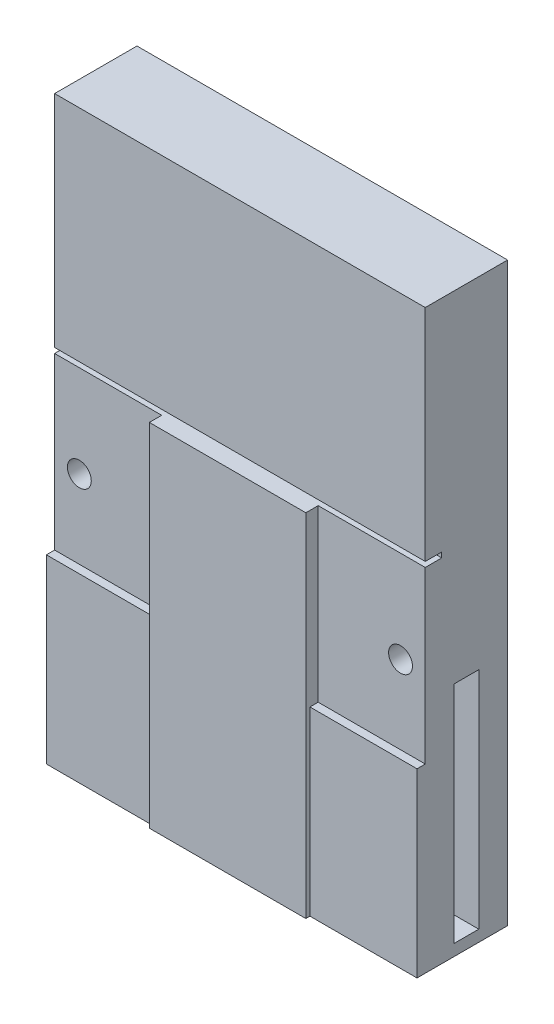
ISO-10303-21;
HEADER;
FILE_DESCRIPTION(('STEP AP214'),'2;1');
FILE_NAME('part.step','',(''),(''),'','','');
FILE_SCHEMA(('AUTOMOTIVE_DESIGN { 1 0 10303 214 1 1 1 1 }'));
ENDSEC;
DATA;
#1=APPLICATION_CONTEXT('core data for automotive mechanical design processes');
#2=APPLICATION_PROTOCOL_DEFINITION('international standard','automotive_design',2000,#1);
#3=PRODUCT_CONTEXT('',#1,'mechanical');
#4=PRODUCT('Part','Part','',(#3));
#5=PRODUCT_RELATED_PRODUCT_CATEGORY('part','',(#4));
#6=PRODUCT_DEFINITION_FORMATION('','',#4);
#7=PRODUCT_DEFINITION_CONTEXT('part definition',#1,'design');
#8=PRODUCT_DEFINITION('design','',#6,#7);
#9=PRODUCT_DEFINITION_SHAPE('','',#8);
#10=(LENGTH_UNIT() NAMED_UNIT(*) SI_UNIT(.MILLI.,.METRE.));
#11=(NAMED_UNIT(*) PLANE_ANGLE_UNIT() SI_UNIT($,.RADIAN.));
#12=(NAMED_UNIT(*) SI_UNIT($,.STERADIAN.) SOLID_ANGLE_UNIT());
#13=UNCERTAINTY_MEASURE_WITH_UNIT(LENGTH_MEASURE(1.E-05),#10,'distance_accuracy_value','');
#14=(GEOMETRIC_REPRESENTATION_CONTEXT(3) GLOBAL_UNCERTAINTY_ASSIGNED_CONTEXT((#13)) GLOBAL_UNIT_ASSIGNED_CONTEXT((#10,
#11,#12)) REPRESENTATION_CONTEXT('',''));
#15=CARTESIAN_POINT('',(0.,0.,0.));
#16=DIRECTION('',(0.,0.,1.));
#17=DIRECTION('',(1.,0.,0.));
#18=AXIS2_PLACEMENT_3D('',#15,#16,#17);
#19=CARTESIAN_POINT('',(-22.5,40.,-4.99999999999999));
#20=DIRECTION('',(1.,0.,0.));
#21=DIRECTION('',(0.,0.,-1.));
#22=AXIS2_PLACEMENT_3D('',#19,#20,#21);
#23=PLANE('',#22);
#24=DIRECTION('',(0.,-1.,0.));
#25=VECTOR('',#24,1.);
#26=CARTESIAN_POINT('',(-22.5,23.2974929319475,3.));
#27=LINE('',#26,#25);
#28=CARTESIAN_POINT('',(-22.5,23.2974929319475,3.));
#29=VERTEX_POINT('',#28);
#30=CARTESIAN_POINT('',(-22.5,22.6713275749144,3.));
#31=VERTEX_POINT('',#30);
#32=EDGE_CURVE('E331',#29,#31,#27,.T.);
#33=ORIENTED_EDGE('',*,*,#32,.F.);
#34=DIRECTION('',(0.,0.,1.));
#35=VECTOR('',#34,1.);
#36=CARTESIAN_POINT('',(-22.5,23.2974929319475,3.));
#37=LINE('',#36,#35);
#38=CARTESIAN_POINT('',(-22.5,23.2974929319475,5.));
#39=VERTEX_POINT('',#38);
#40=EDGE_CURVE('E347',#29,#39,#37,.T.);
#41=ORIENTED_EDGE('',*,*,#40,.T.);
#42=DIRECTION('',(0.,-1.,0.));
#43=VECTOR('',#42,1.);
#44=CARTESIAN_POINT('',(-22.5,40.,5.00000000000001));
#45=LINE('',#44,#43);
#46=CARTESIAN_POINT('',(-22.5,50.,5.));
#47=VERTEX_POINT('',#46);
#48=EDGE_CURVE('E11',#47,#39,#45,.T.);
#49=ORIENTED_EDGE('',*,*,#48,.F.);
#50=DIRECTION('',(0.,0.,1.));
#51=VECTOR('',#50,1.);
#52=CARTESIAN_POINT('',(-22.5,50.,-4.99999999999999));
#53=LINE('',#52,#51);
#54=CARTESIAN_POINT('',(-22.5,50.,-4.99999999999999));
#55=VERTEX_POINT('',#54);
#56=EDGE_CURVE('E371',#55,#47,#53,.T.);
#57=ORIENTED_EDGE('',*,*,#56,.F.);
#58=DIRECTION('',(0.,-1.,0.));
#59=VECTOR('',#58,1.);
#60=CARTESIAN_POINT('',(-22.5,40.,-4.99999999999999));
#61=LINE('',#60,#59);
#62=CARTESIAN_POINT('',(-22.5,-20.,-5.));
#63=VERTEX_POINT('',#62);
#64=EDGE_CURVE('E383',#55,#63,#61,.T.);
#65=ORIENTED_EDGE('',*,*,#64,.T.);
#66=DIRECTION('',(0.,0.,-1.));
#67=VECTOR('',#66,1.);
#68=CARTESIAN_POINT('',(-22.5,-20.,5.00000000000001));
#69=LINE('',#68,#67);
#70=CARTESIAN_POINT('',(-22.5,-20.,6.));
#71=VERTEX_POINT('',#70);
#72=EDGE_CURVE('E363',#71,#63,#69,.T.);
#73=ORIENTED_EDGE('',*,*,#72,.F.);
#74=DIRECTION('',(0.,1.,0.));
#75=VECTOR('',#74,1.);
#76=CARTESIAN_POINT('',(-22.5,2.,6.));
#77=LINE('',#76,#75);
#78=CARTESIAN_POINT('',(-22.5,2.,6.));
#79=VERTEX_POINT('',#78);
#80=EDGE_CURVE('E221',#71,#79,#77,.T.);
#81=ORIENTED_EDGE('',*,*,#80,.T.);
#82=DIRECTION('',(0.,0.,-1.));
#83=VECTOR('',#82,1.);
#84=CARTESIAN_POINT('',(-22.5,2.,6.));
#85=LINE('',#84,#83);
#86=CARTESIAN_POINT('',(-22.5,2.,5.));
#87=VERTEX_POINT('',#86);
#88=EDGE_CURVE('E220',#79,#87,#85,.T.);
#89=ORIENTED_EDGE('',*,*,#88,.T.);
#90=CARTESIAN_POINT('',(-22.5,22.6713275749144,5.));
#91=VERTEX_POINT('',#90);
#92=EDGE_CURVE('E49',#91,#87,#45,.T.);
#93=ORIENTED_EDGE('',*,*,#92,.F.);
#94=DIRECTION('',(0.,0.,1.));
#95=VECTOR('',#94,1.);
#96=CARTESIAN_POINT('',(-22.5,22.6713275749144,3.));
#97=LINE('',#96,#95);
#98=EDGE_CURVE('E342',#31,#91,#97,.T.);
#99=ORIENTED_EDGE('',*,*,#98,.F.);
#100=EDGE_LOOP('',(#33,#41,#49,#57,#65,#73,#81,#89,#93,#99));
#101=FACE_BOUND('',#100,.T.);
#102=DIRECTION('',(0.,-1.,0.));
#103=VECTOR('',#102,1.);
#104=CARTESIAN_POINT('',(-22.5,8.67132757491439,1.5));
#105=LINE('',#104,#103);
#106=CARTESIAN_POINT('',(-22.5,8.67132757491439,1.5));
#107=VERTEX_POINT('',#106);
#108=CARTESIAN_POINT('',(-22.5,-18.6150080325972,1.5));
#109=VERTEX_POINT('',#108);
#110=EDGE_CURVE('E65',#107,#109,#105,.T.);
#111=ORIENTED_EDGE('',*,*,#110,.T.);
#112=DIRECTION('',(0.,0.,-1.));
#113=VECTOR('',#112,1.);
#114=CARTESIAN_POINT('',(-22.5,-18.6150080325972,1.5));
#115=LINE('',#114,#113);
#116=CARTESIAN_POINT('',(-22.5,-18.6150080325972,-1.5));
#117=VERTEX_POINT('',#116);
#118=EDGE_CURVE('E237',#109,#117,#115,.T.);
#119=ORIENTED_EDGE('',*,*,#118,.T.);
#120=DIRECTION('',(0.,1.,0.));
#121=VECTOR('',#120,1.);
#122=CARTESIAN_POINT('',(-22.5,8.67132757491439,-1.5));
#123=LINE('',#122,#121);
#124=CARTESIAN_POINT('',(-22.5,8.67132757491439,-1.5));
#125=VERTEX_POINT('',#124);
#126=EDGE_CURVE('E246',#117,#125,#123,.T.);
#127=ORIENTED_EDGE('',*,*,#126,.T.);
#128=DIRECTION('',(0.,0.,1.));
#129=VECTOR('',#128,1.);
#130=CARTESIAN_POINT('',(-22.5,8.67132757491439,1.5));
#131=LINE('',#130,#129);
#132=EDGE_CURVE('E228',#125,#107,#131,.T.);
#133=ORIENTED_EDGE('',*,*,#132,.T.);
#134=EDGE_LOOP('',(#111,#119,#127,#133));
#135=FACE_BOUND('',#134,.T.);
#136=ADVANCED_FACE('F41',(#101,#135),#23,.F.);
#137=CARTESIAN_POINT('',(22.5,40.,5.));
#138=DIRECTION('',(0.,0.,-1.));
#139=DIRECTION('',(-1.,0.,0.));
#140=AXIS2_PLACEMENT_3D('',#137,#138,#139);
#141=PLANE('',#140);
#142=CARTESIAN_POINT('',(19.5,11.5,5.));
#143=DIRECTION('',(0.,0.,1.));
#144=DIRECTION('',(1.,0.,0.));
#145=AXIS2_PLACEMENT_3D('',#142,#143,#144);
#146=CIRCLE('',#145,1.45);
#147=CARTESIAN_POINT('',(20.95,11.5,5.));
#148=VERTEX_POINT('',#147);
#149=EDGE_CURVE('E357',#148,#148,#146,.T.);
#150=ORIENTED_EDGE('',*,*,#149,.F.);
#151=EDGE_LOOP('',(#150));
#152=FACE_BOUND('',#151,.T.);
#153=DIRECTION('',(-1.,0.,0.));
#154=VECTOR('',#153,1.);
#155=CARTESIAN_POINT('',(9.5,2.,5.));
#156=LINE('',#155,#154);
#157=CARTESIAN_POINT('',(22.5,2.,5.));
#158=VERTEX_POINT('',#157);
#159=CARTESIAN_POINT('',(9.5,2.,5.));
#160=VERTEX_POINT('',#159);
#161=EDGE_CURVE('E253',#158,#160,#156,.T.);
#162=ORIENTED_EDGE('',*,*,#161,.F.);
#163=DIRECTION('',(0.,-1.,0.));
#164=VECTOR('',#163,1.);
#165=CARTESIAN_POINT('',(22.5,40.,5.));
#166=LINE('',#165,#164);
#167=CARTESIAN_POINT('',(22.5,22.6713275749144,5.));
#168=VERTEX_POINT('',#167);
#169=EDGE_CURVE('E387',#168,#158,#166,.T.);
#170=ORIENTED_EDGE('',*,*,#169,.F.);
#171=DIRECTION('',(1.,0.,0.));
#172=VECTOR('',#171,1.);
#173=CARTESIAN_POINT('',(-22.5,22.6713275749144,5.));
#174=LINE('',#173,#172);
#175=CARTESIAN_POINT('',(9.49999999999998,22.6713275749144,5.));
#176=VERTEX_POINT('',#175);
#177=EDGE_CURVE('E330',#176,#168,#174,.T.);
#178=ORIENTED_EDGE('',*,*,#177,.F.);
#179=DIRECTION('',(0.,1.,0.));
#180=VECTOR('',#179,1.);
#181=CARTESIAN_POINT('',(9.49999999999999,22.6713275749144,5.));
#182=LINE('',#181,#180);
#183=EDGE_CURVE('E312',#160,#176,#182,.T.);
#184=ORIENTED_EDGE('',*,*,#183,.F.);
#185=EDGE_LOOP('',(#162,#170,#178,#184));
#186=FACE_BOUND('',#185,.T.);
#187=ADVANCED_FACE('F417',(#152,#186),#141,.F.);
#188=CARTESIAN_POINT('',(9.49999999999999,22.6713275749144,6.5));
#189=DIRECTION('',(-1.,0.,0.));
#190=DIRECTION('',(0.,-1.,0.));
#191=AXIS2_PLACEMENT_3D('',#188,#189,#190);
#192=PLANE('',#191);
#193=DIRECTION('',(0.,0.,-1.));
#194=VECTOR('',#193,1.);
#195=CARTESIAN_POINT('',(9.5,2.,6.));
#196=LINE('',#195,#194);
#197=CARTESIAN_POINT('',(9.49999999999999,2.,6.));
#198=VERTEX_POINT('',#197);
#199=EDGE_CURVE('E270',#198,#160,#196,.T.);
#200=ORIENTED_EDGE('',*,*,#199,.T.);
#201=ORIENTED_EDGE('',*,*,#183,.T.);
#202=DIRECTION('',(0.,0.,-1.));
#203=VECTOR('',#202,1.);
#204=CARTESIAN_POINT('',(9.49999999999999,22.6713275749144,6.5));
#205=LINE('',#204,#203);
#206=CARTESIAN_POINT('',(9.49999999999999,22.6713275749144,6.5));
#207=VERTEX_POINT('',#206);
#208=EDGE_CURVE('E322',#207,#176,#205,.T.);
#209=ORIENTED_EDGE('',*,*,#208,.F.);
#210=DIRECTION('',(0.,1.,0.));
#211=VECTOR('',#210,1.);
#212=CARTESIAN_POINT('',(9.49999999999999,22.6713275749144,6.5));
#213=LINE('',#212,#211);
#214=CARTESIAN_POINT('',(9.5,-20.,6.5));
#215=VERTEX_POINT('',#214);
#216=EDGE_CURVE('E314',#215,#207,#213,.T.);
#217=ORIENTED_EDGE('',*,*,#216,.F.);
#218=DIRECTION('',(0.,0.,-1.));
#219=VECTOR('',#218,1.);
#220=CARTESIAN_POINT('',(9.5,-20.,6.5));
#221=LINE('',#220,#219);
#222=CARTESIAN_POINT('',(9.49999999999999,-20.,6.));
#223=VERTEX_POINT('',#222);
#224=EDGE_CURVE('E325',#215,#223,#221,.T.);
#225=ORIENTED_EDGE('',*,*,#224,.T.);
#226=DIRECTION('',(0.,-1.,0.));
#227=VECTOR('',#226,1.);
#228=CARTESIAN_POINT('',(9.5,2.,6.));
#229=LINE('',#228,#227);
#230=EDGE_CURVE('E259',#198,#223,#229,.T.);
#231=ORIENTED_EDGE('',*,*,#230,.F.);
#232=EDGE_LOOP('',(#200,#201,#209,#217,#225,#231));
#233=FACE_BOUND('',#232,.T.);
#234=ADVANCED_FACE('F424',(#233),#192,.F.);
#235=CARTESIAN_POINT('',(-19.5,11.5,5.));
#236=DIRECTION('',(0.,0.,1.));
#237=DIRECTION('',(1.,0.,0.));
#238=AXIS2_PLACEMENT_3D('',#235,#236,#237);
#239=CIRCLE('',#238,1.45);
#240=CARTESIAN_POINT('',(-18.05,11.5,5.));
#241=VERTEX_POINT('',#240);
#242=EDGE_CURVE('E350',#241,#241,#239,.T.);
#243=ORIENTED_EDGE('',*,*,#242,.F.);
#244=EDGE_LOOP('',(#243));
#245=FACE_BOUND('',#244,.T.);
#246=ORIENTED_EDGE('',*,*,#92,.T.);
#247=DIRECTION('',(1.,0.,0.));
#248=VECTOR('',#247,1.);
#249=CARTESIAN_POINT('',(-9.5,2.,5.));
#250=LINE('',#249,#248);
#251=CARTESIAN_POINT('',(-9.5,2.,5.));
#252=VERTEX_POINT('',#251);
#253=EDGE_CURVE('E213',#87,#252,#250,.T.);
#254=ORIENTED_EDGE('',*,*,#253,.T.);
#255=DIRECTION('',(0.,-1.,0.));
#256=VECTOR('',#255,1.);
#257=CARTESIAN_POINT('',(-9.50000000000001,22.6713275749144,5.));
#258=LINE('',#257,#256);
#259=CARTESIAN_POINT('',(-9.50000000000001,22.6713275749144,5.));
#260=VERTEX_POINT('',#259);
#261=EDGE_CURVE('E226',#260,#252,#258,.T.);
#262=ORIENTED_EDGE('',*,*,#261,.F.);
#263=EDGE_CURVE('E343',#91,#260,#174,.T.);
#264=ORIENTED_EDGE('',*,*,#263,.F.);
#265=EDGE_LOOP('',(#246,#254,#262,#264));
#266=FACE_BOUND('',#265,.T.);
#267=ADVANCED_FACE('F427',(#245,#266),#141,.F.);
#268=ORIENTED_EDGE('',*,*,#48,.T.);
#269=DIRECTION('',(-1.,0.,0.));
#270=VECTOR('',#269,1.);
#271=CARTESIAN_POINT('',(-22.5,23.2974929319475,5.));
#272=LINE('',#271,#270);
#273=CARTESIAN_POINT('',(22.5,23.2974929319475,5.));
#274=VERTEX_POINT('',#273);
#275=EDGE_CURVE('E335',#274,#39,#272,.T.);
#276=ORIENTED_EDGE('',*,*,#275,.F.);
#277=CARTESIAN_POINT('',(22.5,50.,5.));
#278=VERTEX_POINT('',#277);
#279=EDGE_CURVE('E388',#278,#274,#166,.T.);
#280=ORIENTED_EDGE('',*,*,#279,.F.);
#281=DIRECTION('',(1.,0.,0.));
#282=VECTOR('',#281,1.);
#283=CARTESIAN_POINT('',(-22.5,50.,5.));
#284=LINE('',#283,#282);
#285=EDGE_CURVE('E374',#47,#278,#284,.T.);
#286=ORIENTED_EDGE('',*,*,#285,.F.);
#287=EDGE_LOOP('',(#268,#276,#280,#286));
#288=FACE_BOUND('',#287,.T.);
#289=ADVANCED_FACE('F426',(#288),#141,.F.);
#290=CARTESIAN_POINT('',(22.5,40.,-5.));
#291=DIRECTION('',(-1.,0.,0.));
#292=DIRECTION('',(0.,0.,1.));
#293=AXIS2_PLACEMENT_3D('',#290,#291,#292);
#294=PLANE('',#293);
#295=DIRECTION('',(0.,0.,-1.));
#296=VECTOR('',#295,1.);
#297=CARTESIAN_POINT('',(22.5,-18.6150080325972,1.5));
#298=LINE('',#297,#296);
#299=CARTESIAN_POINT('',(22.5,-18.6150080325973,1.5));
#300=VERTEX_POINT('',#299);
#301=CARTESIAN_POINT('',(22.5,-18.6150080325972,-1.5));
#302=VERTEX_POINT('',#301);
#303=EDGE_CURVE('E292',#300,#302,#298,.T.);
#304=ORIENTED_EDGE('',*,*,#303,.F.);
#305=DIRECTION('',(0.,-1.,0.));
#306=VECTOR('',#305,1.);
#307=CARTESIAN_POINT('',(22.5,8.67132757491439,1.5));
#308=LINE('',#307,#306);
#309=CARTESIAN_POINT('',(22.5,8.67132757491439,1.5));
#310=VERTEX_POINT('',#309);
#311=EDGE_CURVE('E276',#310,#300,#308,.T.);
#312=ORIENTED_EDGE('',*,*,#311,.F.);
#313=DIRECTION('',(0.,0.,1.));
#314=VECTOR('',#313,1.);
#315=CARTESIAN_POINT('',(22.5,8.67132757491439,1.5));
#316=LINE('',#315,#314);
#317=CARTESIAN_POINT('',(22.5,8.67132757491439,-1.5));
#318=VERTEX_POINT('',#317);
#319=EDGE_CURVE('E281',#318,#310,#316,.T.);
#320=ORIENTED_EDGE('',*,*,#319,.F.);
#321=DIRECTION('',(0.,1.,0.));
#322=VECTOR('',#321,1.);
#323=CARTESIAN_POINT('',(22.5,8.67132757491439,-1.5));
#324=LINE('',#323,#322);
#325=EDGE_CURVE('E295',#302,#318,#324,.T.);
#326=ORIENTED_EDGE('',*,*,#325,.F.);
#327=EDGE_LOOP('',(#304,#312,#320,#326));
#328=FACE_BOUND('',#327,.T.);
#329=ORIENTED_EDGE('',*,*,#279,.T.);
#330=DIRECTION('',(0.,0.,1.));
#331=VECTOR('',#330,1.);
#332=CARTESIAN_POINT('',(22.5,23.2974929319475,3.));
#333=LINE('',#332,#331);
#334=CARTESIAN_POINT('',(22.5,23.2974929319475,3.));
#335=VERTEX_POINT('',#334);
#336=EDGE_CURVE('E351',#335,#274,#333,.T.);
#337=ORIENTED_EDGE('',*,*,#336,.F.);
#338=DIRECTION('',(0.,1.,0.));
#339=VECTOR('',#338,1.);
#340=CARTESIAN_POINT('',(22.5,23.2974929319475,3.));
#341=LINE('',#340,#339);
#342=CARTESIAN_POINT('',(22.5,22.6713275749144,3.));
#343=VERTEX_POINT('',#342);
#344=EDGE_CURVE('E337',#343,#335,#341,.T.);
#345=ORIENTED_EDGE('',*,*,#344,.F.);
#346=DIRECTION('',(0.,0.,1.));
#347=VECTOR('',#346,1.);
#348=CARTESIAN_POINT('',(22.5,22.6713275749144,3.));
#349=LINE('',#348,#347);
#350=EDGE_CURVE('E353',#343,#168,#349,.T.);
#351=ORIENTED_EDGE('',*,*,#350,.T.);
#352=ORIENTED_EDGE('',*,*,#169,.T.);
#353=DIRECTION('',(0.,0.,-1.));
#354=VECTOR('',#353,1.);
#355=CARTESIAN_POINT('',(22.5,2.,6.));
#356=LINE('',#355,#354);
#357=CARTESIAN_POINT('',(22.5,2.,6.));
#358=VERTEX_POINT('',#357);
#359=EDGE_CURVE('E274',#358,#158,#356,.T.);
#360=ORIENTED_EDGE('',*,*,#359,.F.);
#361=DIRECTION('',(0.,1.,0.));
#362=VECTOR('',#361,1.);
#363=CARTESIAN_POINT('',(22.5,2.,6.));
#364=LINE('',#363,#362);
#365=CARTESIAN_POINT('',(22.5,-20.,6.));
#366=VERTEX_POINT('',#365);
#367=EDGE_CURVE('E265',#366,#358,#364,.T.);
#368=ORIENTED_EDGE('',*,*,#367,.F.);
#369=DIRECTION('',(0.,0.,1.));
#370=VECTOR('',#369,1.);
#371=CARTESIAN_POINT('',(22.5,-20.,5.00000000000001));
#372=LINE('',#371,#370);
#373=CARTESIAN_POINT('',(22.5,-20.,-5.));
#374=VERTEX_POINT('',#373);
#375=EDGE_CURVE('E369',#374,#366,#372,.T.);
#376=ORIENTED_EDGE('',*,*,#375,.F.);
#377=DIRECTION('',(0.,-1.,0.));
#378=VECTOR('',#377,1.);
#379=CARTESIAN_POINT('',(22.5,40.,-5.));
#380=LINE('',#379,#378);
#381=CARTESIAN_POINT('',(22.5,50.,-4.99999999999999));
#382=VERTEX_POINT('',#381);
#383=EDGE_CURVE('E385',#382,#374,#380,.T.);
#384=ORIENTED_EDGE('',*,*,#383,.F.);
#385=DIRECTION('',(0.,0.,-1.));
#386=VECTOR('',#385,1.);
#387=CARTESIAN_POINT('',(22.5,50.,-4.99999999999999));
#388=LINE('',#387,#386);
#389=EDGE_CURVE('E377',#278,#382,#388,.T.);
#390=ORIENTED_EDGE('',*,*,#389,.F.);
#391=EDGE_LOOP('',(#329,#337,#345,#351,#352,#360,#368,#376,#384,#390));
#392=FACE_BOUND('',#391,.T.);
#393=ADVANCED_FACE('F526',(#328,#392),#294,.F.);
#394=CARTESIAN_POINT('',(22.5,40.,-5.));
#395=DIRECTION('',(0.,0.,1.));
#396=DIRECTION('',(1.,0.,0.));
#397=AXIS2_PLACEMENT_3D('',#394,#395,#396);
#398=PLANE('',#397);
#399=CARTESIAN_POINT('',(19.5,11.5,-5.));
#400=DIRECTION('',(0.,0.,1.));
#401=DIRECTION('',(1.,0.,0.));
#402=AXIS2_PLACEMENT_3D('',#399,#400,#401);
#403=CIRCLE('',#402,1.45);
#404=CARTESIAN_POINT('',(20.95,11.5,-5.));
#405=VERTEX_POINT('',#404);
#406=EDGE_CURVE('E44',#405,#405,#403,.T.);
#407=ORIENTED_EDGE('',*,*,#406,.T.);
#408=EDGE_LOOP('',(#407));
#409=FACE_BOUND('',#408,.T.);
#410=CARTESIAN_POINT('',(-19.5,11.5,-4.99999999999999));
#411=DIRECTION('',(0.,0.,1.));
#412=DIRECTION('',(1.,0.,0.));
#413=AXIS2_PLACEMENT_3D('',#410,#411,#412);
#414=CIRCLE('',#413,1.45);
#415=CARTESIAN_POINT('',(-18.05,11.5,-4.99999999999999));
#416=VERTEX_POINT('',#415);
#417=EDGE_CURVE('E360',#416,#416,#414,.T.);
#418=ORIENTED_EDGE('',*,*,#417,.T.);
#419=EDGE_LOOP('',(#418));
#420=FACE_BOUND('',#419,.T.);
#421=ORIENTED_EDGE('',*,*,#383,.T.);
#422=DIRECTION('',(1.,0.,0.));
#423=VECTOR('',#422,1.);
#424=CARTESIAN_POINT('',(-22.5,-20.,-5.));
#425=LINE('',#424,#423);
#426=EDGE_CURVE('E366',#63,#374,#425,.T.);
#427=ORIENTED_EDGE('',*,*,#426,.F.);
#428=ORIENTED_EDGE('',*,*,#64,.F.);
#429=DIRECTION('',(-1.,0.,0.));
#430=VECTOR('',#429,1.);
#431=CARTESIAN_POINT('',(-22.5,50.,-4.99999999999999));
#432=LINE('',#431,#430);
#433=EDGE_CURVE('E380',#382,#55,#432,.T.);
#434=ORIENTED_EDGE('',*,*,#433,.F.);
#435=EDGE_LOOP('',(#421,#427,#428,#434));
#436=FACE_BOUND('',#435,.T.);
#437=ADVANCED_FACE('F396',(#409,#420,#436),#398,.F.);
#438=CARTESIAN_POINT('',(0.,50.,0.));
#439=DIRECTION('',(0.,1.,0.));
#440=DIRECTION('',(0.,0.,1.));
#441=AXIS2_PLACEMENT_3D('',#438,#439,#440);
#442=PLANE('',#441);
#443=ORIENTED_EDGE('',*,*,#56,.T.);
#444=ORIENTED_EDGE('',*,*,#285,.T.);
#445=ORIENTED_EDGE('',*,*,#389,.T.);
#446=ORIENTED_EDGE('',*,*,#433,.T.);
#447=EDGE_LOOP('',(#443,#444,#445,#446));
#448=FACE_BOUND('',#447,.T.);
#449=ADVANCED_FACE('F537',(#448),#442,.T.);
#450=CARTESIAN_POINT('',(0.,-20.,0.));
#451=DIRECTION('',(0.,-1.,0.));
#452=DIRECTION('',(0.,0.,-1.));
#453=AXIS2_PLACEMENT_3D('',#450,#451,#452);
#454=PLANE('',#453);
#455=DIRECTION('',(-1.,0.,0.));
#456=VECTOR('',#455,1.);
#457=CARTESIAN_POINT('',(-9.49999999999999,-20.,6.));
#458=LINE('',#457,#456);
#459=CARTESIAN_POINT('',(-9.5,-20.,6.));
#460=VERTEX_POINT('',#459);
#461=EDGE_CURVE('E57',#460,#71,#458,.T.);
#462=ORIENTED_EDGE('',*,*,#461,.T.);
#463=ORIENTED_EDGE('',*,*,#72,.T.);
#464=ORIENTED_EDGE('',*,*,#426,.T.);
#465=ORIENTED_EDGE('',*,*,#375,.T.);
#466=DIRECTION('',(1.,0.,0.));
#467=VECTOR('',#466,1.);
#468=CARTESIAN_POINT('',(9.49999999999999,-20.,6.));
#469=LINE('',#468,#467);
#470=EDGE_CURVE('E262',#223,#366,#469,.T.);
#471=ORIENTED_EDGE('',*,*,#470,.F.);
#472=ORIENTED_EDGE('',*,*,#224,.F.);
#473=DIRECTION('',(1.,0.,0.));
#474=VECTOR('',#473,1.);
#475=CARTESIAN_POINT('',(-9.5,-20.,6.5));
#476=LINE('',#475,#474);
#477=CARTESIAN_POINT('',(-9.5,-20.,6.5));
#478=VERTEX_POINT('',#477);
#479=EDGE_CURVE('E311',#478,#215,#476,.T.);
#480=ORIENTED_EDGE('',*,*,#479,.F.);
#481=DIRECTION('',(0.,0.,-1.));
#482=VECTOR('',#481,1.);
#483=CARTESIAN_POINT('',(-9.5,-20.,6.5));
#484=LINE('',#483,#482);
#485=EDGE_CURVE('E328',#478,#460,#484,.T.);
#486=ORIENTED_EDGE('',*,*,#485,.T.);
#487=EDGE_LOOP('',(#462,#463,#464,#465,#471,#472,#480,#486));
#488=FACE_BOUND('',#487,.T.);
#489=ADVANCED_FACE('F412',(#488),#454,.T.);
#490=CARTESIAN_POINT('',(-19.5,11.5,-15.));
#491=DIRECTION('',(0.,0.,1.));
#492=DIRECTION('',(1.,0.,0.));
#493=AXIS2_PLACEMENT_3D('',#490,#491,#492);
#494=CYLINDRICAL_SURFACE('',#493,1.45);
#495=ORIENTED_EDGE('',*,*,#242,.T.);
#496=EDGE_LOOP('',(#495));
#497=FACE_BOUND('',#496,.T.);
#498=ORIENTED_EDGE('',*,*,#417,.F.);
#499=EDGE_LOOP('',(#498));
#500=FACE_BOUND('',#499,.T.);
#501=ADVANCED_FACE('F401',(#497,#500),#494,.F.);
#502=CARTESIAN_POINT('',(19.5,11.5,-15.));
#503=DIRECTION('',(0.,0.,1.));
#504=DIRECTION('',(1.,0.,0.));
#505=AXIS2_PLACEMENT_3D('',#502,#503,#504);
#506=CYLINDRICAL_SURFACE('',#505,1.45);
#507=ORIENTED_EDGE('',*,*,#149,.T.);
#508=EDGE_LOOP('',(#507));
#509=FACE_BOUND('',#508,.T.);
#510=ORIENTED_EDGE('',*,*,#406,.F.);
#511=EDGE_LOOP('',(#510));
#512=FACE_BOUND('',#511,.T.);
#513=ADVANCED_FACE('F398',(#509,#512),#506,.F.);
#514=CARTESIAN_POINT('',(-22.5,23.2974929319475,3.));
#515=DIRECTION('',(0.,1.,0.));
#516=DIRECTION('',(0.,0.,1.));
#517=AXIS2_PLACEMENT_3D('',#514,#515,#516);
#518=PLANE('',#517);
#519=ORIENTED_EDGE('',*,*,#275,.T.);
#520=ORIENTED_EDGE('',*,*,#40,.F.);
#521=DIRECTION('',(-1.,0.,0.));
#522=VECTOR('',#521,1.);
#523=CARTESIAN_POINT('',(-22.5,23.2974929319475,3.));
#524=LINE('',#523,#522);
#525=EDGE_CURVE('E339',#335,#29,#524,.T.);
#526=ORIENTED_EDGE('',*,*,#525,.F.);
#527=ORIENTED_EDGE('',*,*,#336,.T.);
#528=EDGE_LOOP('',(#519,#520,#526,#527));
#529=FACE_BOUND('',#528,.T.);
#530=ADVANCED_FACE('F400',(#529),#518,.F.);
#531=CARTESIAN_POINT('',(-22.5,22.6713275749144,3.));
#532=DIRECTION('',(0.,-1.,0.));
#533=DIRECTION('',(0.,0.,-1.));
#534=AXIS2_PLACEMENT_3D('',#531,#532,#533);
#535=PLANE('',#534);
#536=ORIENTED_EDGE('',*,*,#263,.T.);
#537=DIRECTION('',(0.,0.,-1.));
#538=VECTOR('',#537,1.);
#539=CARTESIAN_POINT('',(-9.50000000000001,22.6713275749144,6.5));
#540=LINE('',#539,#538);
#541=CARTESIAN_POINT('',(-9.50000000000001,22.6713275749144,6.5));
#542=VERTEX_POINT('',#541);
#543=EDGE_CURVE('E318',#542,#260,#540,.T.);
#544=ORIENTED_EDGE('',*,*,#543,.F.);
#545=DIRECTION('',(-1.,0.,0.));
#546=VECTOR('',#545,1.);
#547=CARTESIAN_POINT('',(-9.50000000000001,22.6713275749144,6.5));
#548=LINE('',#547,#546);
#549=EDGE_CURVE('E316',#207,#542,#548,.T.);
#550=ORIENTED_EDGE('',*,*,#549,.F.);
#551=ORIENTED_EDGE('',*,*,#208,.T.);
#552=ORIENTED_EDGE('',*,*,#177,.T.);
#553=ORIENTED_EDGE('',*,*,#350,.F.);
#554=DIRECTION('',(1.,0.,0.));
#555=VECTOR('',#554,1.);
#556=CARTESIAN_POINT('',(-22.5,22.6713275749144,3.));
#557=LINE('',#556,#555);
#558=EDGE_CURVE('E334',#31,#343,#557,.T.);
#559=ORIENTED_EDGE('',*,*,#558,.F.);
#560=ORIENTED_EDGE('',*,*,#98,.T.);
#561=EDGE_LOOP('',(#536,#544,#550,#551,#552,#553,#559,#560));
#562=FACE_BOUND('',#561,.T.);
#563=ADVANCED_FACE('F409',(#562),#535,.F.);
#564=CARTESIAN_POINT('',(0.,0.,3.));
#565=DIRECTION('',(0.,0.,1.));
#566=DIRECTION('',(1.,0.,0.));
#567=AXIS2_PLACEMENT_3D('',#564,#565,#566);
#568=PLANE('',#567);
#569=ORIENTED_EDGE('',*,*,#32,.T.);
#570=ORIENTED_EDGE('',*,*,#558,.T.);
#571=ORIENTED_EDGE('',*,*,#344,.T.);
#572=ORIENTED_EDGE('',*,*,#525,.T.);
#573=EDGE_LOOP('',(#569,#570,#571,#572));
#574=FACE_BOUND('',#573,.T.);
#575=ADVANCED_FACE('F497',(#574),#568,.T.);
#576=CARTESIAN_POINT('',(-9.50000000000001,22.6713275749144,6.5));
#577=DIRECTION('',(1.,0.,0.));
#578=DIRECTION('',(0.,1.,0.));
#579=AXIS2_PLACEMENT_3D('',#576,#577,#578);
#580=PLANE('',#579);
#581=ORIENTED_EDGE('',*,*,#261,.T.);
#582=DIRECTION('',(0.,0.,-1.));
#583=VECTOR('',#582,1.);
#584=CARTESIAN_POINT('',(-9.5,2.,6.));
#585=LINE('',#584,#583);
#586=CARTESIAN_POINT('',(-9.5,2.,6.));
#587=VERTEX_POINT('',#586);
#588=EDGE_CURVE('E218',#587,#252,#585,.T.);
#589=ORIENTED_EDGE('',*,*,#588,.F.);
#590=DIRECTION('',(0.,-1.,0.));
#591=VECTOR('',#590,1.);
#592=CARTESIAN_POINT('',(-9.5,2.,6.));
#593=LINE('',#592,#591);
#594=EDGE_CURVE('E204',#587,#460,#593,.T.);
#595=ORIENTED_EDGE('',*,*,#594,.T.);
#596=ORIENTED_EDGE('',*,*,#485,.F.);
#597=DIRECTION('',(0.,-1.,0.));
#598=VECTOR('',#597,1.);
#599=CARTESIAN_POINT('',(-9.50000000000001,22.6713275749144,6.5));
#600=LINE('',#599,#598);
#601=EDGE_CURVE('E308',#542,#478,#600,.T.);
#602=ORIENTED_EDGE('',*,*,#601,.F.);
#603=ORIENTED_EDGE('',*,*,#543,.T.);
#604=EDGE_LOOP('',(#581,#589,#595,#596,#602,#603));
#605=FACE_BOUND('',#604,.T.);
#606=ADVANCED_FACE('F224',(#605),#580,.F.);
#607=CARTESIAN_POINT('',(0.,0.,6.5));
#608=DIRECTION('',(0.,0.,1.));
#609=DIRECTION('',(1.,0.,0.));
#610=AXIS2_PLACEMENT_3D('',#607,#608,#609);
#611=PLANE('',#610);
#612=ORIENTED_EDGE('',*,*,#601,.T.);
#613=ORIENTED_EDGE('',*,*,#479,.T.);
#614=ORIENTED_EDGE('',*,*,#216,.T.);
#615=ORIENTED_EDGE('',*,*,#549,.T.);
#616=EDGE_LOOP('',(#612,#613,#614,#615));
#617=FACE_BOUND('',#616,.T.);
#618=ADVANCED_FACE('F487',(#617),#611,.T.);
#619=CARTESIAN_POINT('',(12.5,8.67132757491439,1.5));
#620=DIRECTION('',(0.,0.,1.));
#621=DIRECTION('',(1.,0.,0.));
#622=AXIS2_PLACEMENT_3D('',#619,#620,#621);
#623=PLANE('',#622);
#624=ORIENTED_EDGE('',*,*,#311,.T.);
#625=DIRECTION('',(1.,0.,0.));
#626=VECTOR('',#625,1.);
#627=CARTESIAN_POINT('',(12.5,-18.6150080325972,1.5));
#628=LINE('',#627,#626);
#629=CARTESIAN_POINT('',(12.5,-18.6150080325972,1.5));
#630=VERTEX_POINT('',#629);
#631=EDGE_CURVE('E290',#630,#300,#628,.T.);
#632=ORIENTED_EDGE('',*,*,#631,.F.);
#633=DIRECTION('',(0.,-1.,0.));
#634=VECTOR('',#633,1.);
#635=CARTESIAN_POINT('',(12.5,8.67132757491439,1.5));
#636=LINE('',#635,#634);
#637=CARTESIAN_POINT('',(12.5,8.67132757491439,1.5));
#638=VERTEX_POINT('',#637);
#639=EDGE_CURVE('E277',#638,#630,#636,.T.);
#640=ORIENTED_EDGE('',*,*,#639,.F.);
#641=DIRECTION('',(1.,0.,0.));
#642=VECTOR('',#641,1.);
#643=CARTESIAN_POINT('',(12.5,8.67132757491439,1.5));
#644=LINE('',#643,#642);
#645=EDGE_CURVE('E300',#638,#310,#644,.T.);
#646=ORIENTED_EDGE('',*,*,#645,.T.);
#647=EDGE_LOOP('',(#624,#632,#640,#646));
#648=FACE_BOUND('',#647,.T.);
#649=ADVANCED_FACE('F477',(#648),#623,.F.);
#650=CARTESIAN_POINT('',(12.5,8.67132757491439,1.5));
#651=DIRECTION('',(0.,1.,0.));
#652=DIRECTION('',(0.,0.,1.));
#653=AXIS2_PLACEMENT_3D('',#650,#651,#652);
#654=PLANE('',#653);
#655=ORIENTED_EDGE('',*,*,#319,.T.);
#656=ORIENTED_EDGE('',*,*,#645,.F.);
#657=DIRECTION('',(0.,0.,1.));
#658=VECTOR('',#657,1.);
#659=CARTESIAN_POINT('',(12.5,8.67132757491439,1.5));
#660=LINE('',#659,#658);
#661=CARTESIAN_POINT('',(12.5,8.67132757491439,-1.5));
#662=VERTEX_POINT('',#661);
#663=EDGE_CURVE('E287',#662,#638,#660,.T.);
#664=ORIENTED_EDGE('',*,*,#663,.F.);
#665=DIRECTION('',(1.,0.,0.));
#666=VECTOR('',#665,1.);
#667=CARTESIAN_POINT('',(12.5,8.67132757491439,-1.5));
#668=LINE('',#667,#666);
#669=EDGE_CURVE('E302',#662,#318,#668,.T.);
#670=ORIENTED_EDGE('',*,*,#669,.T.);
#671=EDGE_LOOP('',(#655,#656,#664,#670));
#672=FACE_BOUND('',#671,.T.);
#673=ADVANCED_FACE('F473',(#672),#654,.F.);
#674=CARTESIAN_POINT('',(12.5,8.67132757491439,-1.5));
#675=DIRECTION('',(0.,0.,-1.));
#676=DIRECTION('',(-1.,0.,0.));
#677=AXIS2_PLACEMENT_3D('',#674,#675,#676);
#678=PLANE('',#677);
#679=ORIENTED_EDGE('',*,*,#325,.T.);
#680=ORIENTED_EDGE('',*,*,#669,.F.);
#681=DIRECTION('',(0.,1.,0.));
#682=VECTOR('',#681,1.);
#683=CARTESIAN_POINT('',(12.5,8.67132757491439,-1.5));
#684=LINE('',#683,#682);
#685=CARTESIAN_POINT('',(12.5,-18.6150080325972,-1.5));
#686=VERTEX_POINT('',#685);
#687=EDGE_CURVE('E284',#686,#662,#684,.T.);
#688=ORIENTED_EDGE('',*,*,#687,.F.);
#689=DIRECTION('',(1.,0.,0.));
#690=VECTOR('',#689,1.);
#691=CARTESIAN_POINT('',(12.5,-18.6150080325972,-1.5));
#692=LINE('',#691,#690);
#693=EDGE_CURVE('E304',#686,#302,#692,.T.);
#694=ORIENTED_EDGE('',*,*,#693,.T.);
#695=EDGE_LOOP('',(#679,#680,#688,#694));
#696=FACE_BOUND('',#695,.T.);
#697=ADVANCED_FACE('F476',(#696),#678,.F.);
#698=CARTESIAN_POINT('',(12.5,-18.6150080325972,1.5));
#699=DIRECTION('',(0.,-1.,0.));
#700=DIRECTION('',(0.,0.,-1.));
#701=AXIS2_PLACEMENT_3D('',#698,#699,#700);
#702=PLANE('',#701);
#703=ORIENTED_EDGE('',*,*,#303,.T.);
#704=ORIENTED_EDGE('',*,*,#693,.F.);
#705=DIRECTION('',(0.,0.,-1.));
#706=VECTOR('',#705,1.);
#707=CARTESIAN_POINT('',(12.5,-18.6150080325972,1.5));
#708=LINE('',#707,#706);
#709=EDGE_CURVE('E280',#630,#686,#708,.T.);
#710=ORIENTED_EDGE('',*,*,#709,.F.);
#711=ORIENTED_EDGE('',*,*,#631,.T.);
#712=EDGE_LOOP('',(#703,#704,#710,#711));
#713=FACE_BOUND('',#712,.T.);
#714=ADVANCED_FACE('F471',(#713),#702,.F.);
#715=CARTESIAN_POINT('',(12.5,0.,0.));
#716=DIRECTION('',(1.,0.,0.));
#717=DIRECTION('',(0.,0.,-1.));
#718=AXIS2_PLACEMENT_3D('',#715,#716,#717);
#719=PLANE('',#718);
#720=ORIENTED_EDGE('',*,*,#639,.T.);
#721=ORIENTED_EDGE('',*,*,#709,.T.);
#722=ORIENTED_EDGE('',*,*,#687,.T.);
#723=ORIENTED_EDGE('',*,*,#663,.T.);
#724=EDGE_LOOP('',(#720,#721,#722,#723));
#725=FACE_BOUND('',#724,.T.);
#726=ADVANCED_FACE('F467',(#725),#719,.T.);
#727=CARTESIAN_POINT('',(9.5,2.,6.));
#728=DIRECTION('',(0.,-1.,0.));
#729=DIRECTION('',(0.,0.,-1.));
#730=AXIS2_PLACEMENT_3D('',#727,#728,#729);
#731=PLANE('',#730);
#732=ORIENTED_EDGE('',*,*,#161,.T.);
#733=ORIENTED_EDGE('',*,*,#199,.F.);
#734=DIRECTION('',(-1.,0.,0.));
#735=VECTOR('',#734,1.);
#736=CARTESIAN_POINT('',(9.5,2.,6.));
#737=LINE('',#736,#735);
#738=EDGE_CURVE('E267',#358,#198,#737,.T.);
#739=ORIENTED_EDGE('',*,*,#738,.F.);
#740=ORIENTED_EDGE('',*,*,#359,.T.);
#741=EDGE_LOOP('',(#732,#733,#739,#740));
#742=FACE_BOUND('',#741,.T.);
#743=ADVANCED_FACE('F463',(#742),#731,.F.);
#744=CARTESIAN_POINT('',(0.,0.,6.));
#745=DIRECTION('',(0.,0.,1.));
#746=DIRECTION('',(1.,0.,0.));
#747=AXIS2_PLACEMENT_3D('',#744,#745,#746);
#748=PLANE('',#747);
#749=ORIENTED_EDGE('',*,*,#230,.T.);
#750=ORIENTED_EDGE('',*,*,#470,.T.);
#751=ORIENTED_EDGE('',*,*,#367,.T.);
#752=ORIENTED_EDGE('',*,*,#738,.T.);
#753=EDGE_LOOP('',(#749,#750,#751,#752));
#754=FACE_BOUND('',#753,.T.);
#755=ADVANCED_FACE('F460',(#754),#748,.T.);
#756=CARTESIAN_POINT('',(-12.5,8.67132757491439,1.5));
#757=DIRECTION('',(0.,0.,-1.));
#758=DIRECTION('',(-1.,0.,0.));
#759=AXIS2_PLACEMENT_3D('',#756,#757,#758);
#760=PLANE('',#759);
#761=ORIENTED_EDGE('',*,*,#110,.F.);
#762=DIRECTION('',(-1.,0.,0.));
#763=VECTOR('',#762,1.);
#764=CARTESIAN_POINT('',(-12.5,8.67132757491439,1.5));
#765=LINE('',#764,#763);
#766=CARTESIAN_POINT('',(-12.5,8.67132757491439,1.5));
#767=VERTEX_POINT('',#766);
#768=EDGE_CURVE('E242',#767,#107,#765,.T.);
#769=ORIENTED_EDGE('',*,*,#768,.F.);
#770=DIRECTION('',(0.,-1.,0.));
#771=VECTOR('',#770,1.);
#772=CARTESIAN_POINT('',(-12.5,8.67132757491439,1.5));
#773=LINE('',#772,#771);
#774=CARTESIAN_POINT('',(-12.5,-18.6150080325972,1.5));
#775=VERTEX_POINT('',#774);
#776=EDGE_CURVE('E233',#767,#775,#773,.T.);
#777=ORIENTED_EDGE('',*,*,#776,.T.);
#778=DIRECTION('',(-1.,0.,0.));
#779=VECTOR('',#778,1.);
#780=CARTESIAN_POINT('',(-12.5,-18.6150080325972,1.5));
#781=LINE('',#780,#779);
#782=EDGE_CURVE('E251',#775,#109,#781,.T.);
#783=ORIENTED_EDGE('',*,*,#782,.T.);
#784=EDGE_LOOP('',(#761,#769,#777,#783));
#785=FACE_BOUND('',#784,.T.);
#786=ADVANCED_FACE('F438',(#785),#760,.T.);
#787=CARTESIAN_POINT('',(-12.5,-18.6150080325972,1.5));
#788=DIRECTION('',(0.,1.,0.));
#789=DIRECTION('',(0.,0.,1.));
#790=AXIS2_PLACEMENT_3D('',#787,#788,#789);
#791=PLANE('',#790);
#792=ORIENTED_EDGE('',*,*,#118,.F.);
#793=ORIENTED_EDGE('',*,*,#782,.F.);
#794=DIRECTION('',(0.,0.,-1.));
#795=VECTOR('',#794,1.);
#796=CARTESIAN_POINT('',(-12.5,-18.6150080325972,1.5));
#797=LINE('',#796,#795);
#798=CARTESIAN_POINT('',(-12.5,-18.6150080325972,-1.5));
#799=VERTEX_POINT('',#798);
#800=EDGE_CURVE('E241',#775,#799,#797,.T.);
#801=ORIENTED_EDGE('',*,*,#800,.T.);
#802=DIRECTION('',(-1.,0.,0.));
#803=VECTOR('',#802,1.);
#804=CARTESIAN_POINT('',(-12.5,-18.6150080325972,-1.5));
#805=LINE('',#804,#803);
#806=EDGE_CURVE('E254',#799,#117,#805,.T.);
#807=ORIENTED_EDGE('',*,*,#806,.T.);
#808=EDGE_LOOP('',(#792,#793,#801,#807));
#809=FACE_BOUND('',#808,.T.);
#810=ADVANCED_FACE('F445',(#809),#791,.T.);
#811=CARTESIAN_POINT('',(-12.5,8.67132757491439,-1.5));
#812=DIRECTION('',(0.,0.,1.));
#813=DIRECTION('',(1.,0.,0.));
#814=AXIS2_PLACEMENT_3D('',#811,#812,#813);
#815=PLANE('',#814);
#816=ORIENTED_EDGE('',*,*,#126,.F.);
#817=ORIENTED_EDGE('',*,*,#806,.F.);
#818=DIRECTION('',(0.,1.,0.));
#819=VECTOR('',#818,1.);
#820=CARTESIAN_POINT('',(-12.5,8.67132757491439,-1.5));
#821=LINE('',#820,#819);
#822=CARTESIAN_POINT('',(-12.5,8.67132757491439,-1.5));
#823=VERTEX_POINT('',#822);
#824=EDGE_CURVE('E239',#799,#823,#821,.T.);
#825=ORIENTED_EDGE('',*,*,#824,.T.);
#826=DIRECTION('',(-1.,0.,0.));
#827=VECTOR('',#826,1.);
#828=CARTESIAN_POINT('',(-12.5,8.67132757491439,-1.5));
#829=LINE('',#828,#827);
#830=EDGE_CURVE('E256',#823,#125,#829,.T.);
#831=ORIENTED_EDGE('',*,*,#830,.T.);
#832=EDGE_LOOP('',(#816,#817,#825,#831));
#833=FACE_BOUND('',#832,.T.);
#834=ADVANCED_FACE('F447',(#833),#815,.T.);
#835=CARTESIAN_POINT('',(-12.5,8.67132757491439,1.5));
#836=DIRECTION('',(0.,-1.,0.));
#837=DIRECTION('',(0.,0.,-1.));
#838=AXIS2_PLACEMENT_3D('',#835,#836,#837);
#839=PLANE('',#838);
#840=ORIENTED_EDGE('',*,*,#132,.F.);
#841=ORIENTED_EDGE('',*,*,#830,.F.);
#842=DIRECTION('',(0.,0.,1.));
#843=VECTOR('',#842,1.);
#844=CARTESIAN_POINT('',(-12.5,8.67132757491439,1.5));
#845=LINE('',#844,#843);
#846=EDGE_CURVE('E236',#823,#767,#845,.T.);
#847=ORIENTED_EDGE('',*,*,#846,.T.);
#848=ORIENTED_EDGE('',*,*,#768,.T.);
#849=EDGE_LOOP('',(#840,#841,#847,#848));
#850=FACE_BOUND('',#849,.T.);
#851=ADVANCED_FACE('F435',(#850),#839,.T.);
#852=CARTESIAN_POINT('',(-12.5,0.,0.));
#853=DIRECTION('',(-1.,0.,0.));
#854=DIRECTION('',(0.,0.,-1.));
#855=AXIS2_PLACEMENT_3D('',#852,#853,#854);
#856=PLANE('',#855);
#857=ORIENTED_EDGE('',*,*,#776,.F.);
#858=ORIENTED_EDGE('',*,*,#846,.F.);
#859=ORIENTED_EDGE('',*,*,#824,.F.);
#860=ORIENTED_EDGE('',*,*,#800,.F.);
#861=EDGE_LOOP('',(#857,#858,#859,#860));
#862=FACE_BOUND('',#861,.T.);
#863=ADVANCED_FACE('F441',(#862),#856,.T.);
#864=CARTESIAN_POINT('',(-9.5,2.,6.));
#865=DIRECTION('',(0.,1.,0.));
#866=DIRECTION('',(0.,0.,1.));
#867=AXIS2_PLACEMENT_3D('',#864,#865,#866);
#868=PLANE('',#867);
#869=ORIENTED_EDGE('',*,*,#253,.F.);
#870=ORIENTED_EDGE('',*,*,#88,.F.);
#871=DIRECTION('',(1.,0.,0.));
#872=VECTOR('',#871,1.);
#873=CARTESIAN_POINT('',(-9.5,2.,6.));
#874=LINE('',#873,#872);
#875=EDGE_CURVE('E207',#79,#587,#874,.T.);
#876=ORIENTED_EDGE('',*,*,#875,.T.);
#877=ORIENTED_EDGE('',*,*,#588,.T.);
#878=EDGE_LOOP('',(#869,#870,#876,#877));
#879=FACE_BOUND('',#878,.T.);
#880=ADVANCED_FACE('F217',(#879),#868,.T.);
#881=CARTESIAN_POINT('',(0.,0.,6.));
#882=DIRECTION('',(0.,0.,1.));
#883=DIRECTION('',(-1.,0.,0.));
#884=AXIS2_PLACEMENT_3D('',#881,#882,#883);
#885=PLANE('',#884);
#886=ORIENTED_EDGE('',*,*,#594,.F.);
#887=ORIENTED_EDGE('',*,*,#875,.F.);
#888=ORIENTED_EDGE('',*,*,#80,.F.);
#889=ORIENTED_EDGE('',*,*,#461,.F.);
#890=EDGE_LOOP('',(#886,#887,#888,#889));
#891=FACE_BOUND('',#890,.T.);
#892=ADVANCED_FACE('F206',(#891),#885,.T.);
#893=CLOSED_SHELL('',(#136,#187,#234,#267,#289,#393,#437,#449,#489,#501,#513,#530,#563,#575,
#606,#618,#649,#673,#697,#714,#726,#743,#755,#786,#810,#834,#851,#863,#880,#892));
#894=MANIFOLD_SOLID_BREP('B2',#893);
#895=ADVANCED_BREP_SHAPE_REPRESENTATION('',(#18,#894),#14);
#896=SHAPE_DEFINITION_REPRESENTATION(#9,#895);
ENDSEC;
END-ISO-10303-21;
